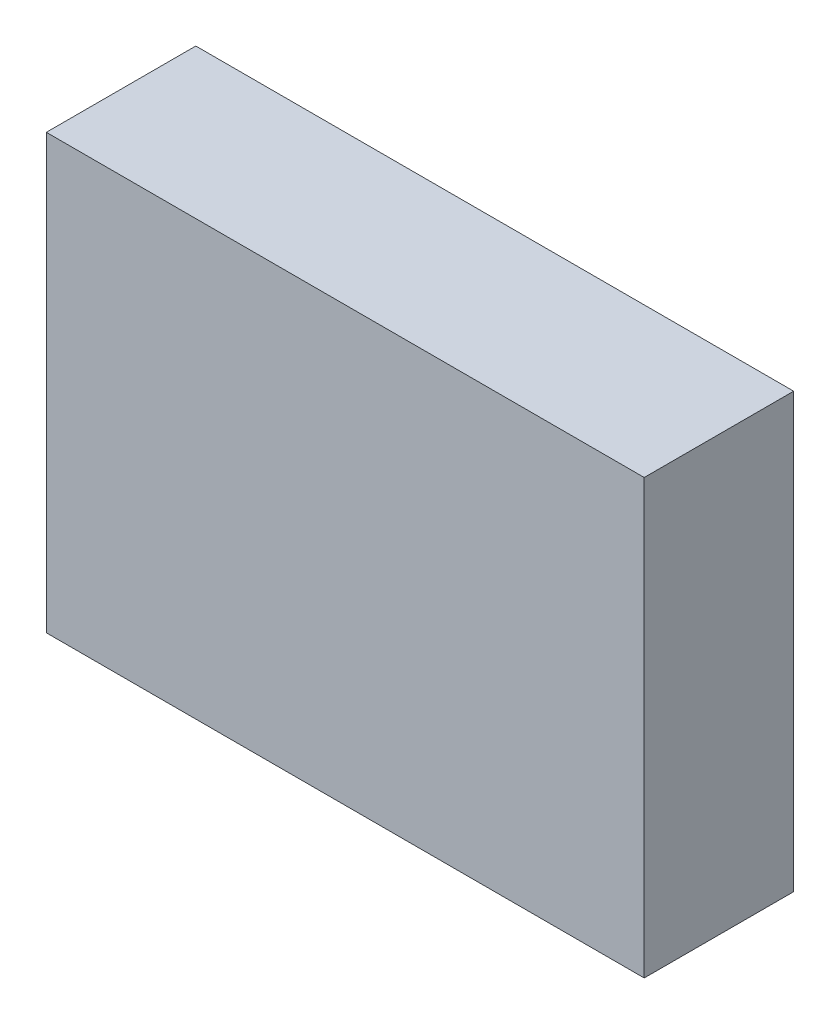
ISO-10303-21;
HEADER;
FILE_DESCRIPTION(('STEP AP214'),'2;1');
FILE_NAME('part.step','',(''),(''),'','','');
FILE_SCHEMA(('AUTOMOTIVE_DESIGN { 1 0 10303 214 1 1 1 1 }'));
ENDSEC;
DATA;
#1=APPLICATION_CONTEXT('core data for automotive mechanical design processes');
#2=APPLICATION_PROTOCOL_DEFINITION('international standard','automotive_design',2000,#1);
#3=PRODUCT_CONTEXT('',#1,'mechanical');
#4=PRODUCT('Part','Part','',(#3));
#5=PRODUCT_RELATED_PRODUCT_CATEGORY('part','',(#4));
#6=PRODUCT_DEFINITION_FORMATION('','',#4);
#7=PRODUCT_DEFINITION_CONTEXT('part definition',#1,'design');
#8=PRODUCT_DEFINITION('design','',#6,#7);
#9=PRODUCT_DEFINITION_SHAPE('','',#8);
#10=(LENGTH_UNIT() NAMED_UNIT(*) SI_UNIT(.MILLI.,.METRE.));
#11=(NAMED_UNIT(*) PLANE_ANGLE_UNIT() SI_UNIT($,.RADIAN.));
#12=(NAMED_UNIT(*) SI_UNIT($,.STERADIAN.) SOLID_ANGLE_UNIT());
#13=UNCERTAINTY_MEASURE_WITH_UNIT(LENGTH_MEASURE(1.E-05),#10,'distance_accuracy_value','');
#14=(GEOMETRIC_REPRESENTATION_CONTEXT(3) GLOBAL_UNCERTAINTY_ASSIGNED_CONTEXT((#13)) GLOBAL_UNIT_ASSIGNED_CONTEXT((#10,
#11,#12)) REPRESENTATION_CONTEXT('',''));
#15=CARTESIAN_POINT('',(0.,0.,0.));
#16=DIRECTION('',(0.,0.,1.));
#17=DIRECTION('',(1.,0.,0.));
#18=AXIS2_PLACEMENT_3D('',#15,#16,#17);
#19=CARTESIAN_POINT('',(0.,0.,-10.));
#20=DIRECTION('',(-1.,0.,0.));
#21=DIRECTION('',(0.,0.,1.));
#22=AXIS2_PLACEMENT_3D('',#19,#20,#21);
#23=PLANE('',#22);
#24=DIRECTION('',(0.,-1.,0.));
#25=VECTOR('',#24,1.);
#26=CARTESIAN_POINT('',(0.,0.,0.));
#27=LINE('',#26,#25);
#28=CARTESIAN_POINT('',(0.,29.,0.));
#29=VERTEX_POINT('',#28);
#30=CARTESIAN_POINT('',(0.,0.,0.));
#31=VERTEX_POINT('',#30);
#32=EDGE_CURVE('E107',#29,#31,#27,.T.);
#33=ORIENTED_EDGE('',*,*,#32,.F.);
#34=DIRECTION('',(0.,0.,1.));
#35=VECTOR('',#34,1.);
#36=CARTESIAN_POINT('',(0.,29.,-10.));
#37=LINE('',#36,#35);
#38=CARTESIAN_POINT('',(0.,29.,-10.));
#39=VERTEX_POINT('',#38);
#40=EDGE_CURVE('E11',#39,#29,#37,.T.);
#41=ORIENTED_EDGE('',*,*,#40,.F.);
#42=DIRECTION('',(0.,-1.,0.));
#43=VECTOR('',#42,1.);
#44=CARTESIAN_POINT('',(0.,0.,-10.));
#45=LINE('',#44,#43);
#46=CARTESIAN_POINT('',(0.,0.,-10.));
#47=VERTEX_POINT('',#46);
#48=EDGE_CURVE('E102',#39,#47,#45,.T.);
#49=ORIENTED_EDGE('',*,*,#48,.T.);
#50=DIRECTION('',(0.,0.,1.));
#51=VECTOR('',#50,1.);
#52=CARTESIAN_POINT('',(0.,0.,-10.));
#53=LINE('',#52,#51);
#54=EDGE_CURVE('E46',#47,#31,#53,.T.);
#55=ORIENTED_EDGE('',*,*,#54,.T.);
#56=EDGE_LOOP('',(#33,#41,#49,#55));
#57=FACE_BOUND('',#56,.T.);
#58=ADVANCED_FACE('F43',(#57),#23,.T.);
#59=CARTESIAN_POINT('',(0.,29.,-10.));
#60=DIRECTION('',(0.,1.,0.));
#61=DIRECTION('',(0.,0.,1.));
#62=AXIS2_PLACEMENT_3D('',#59,#60,#61);
#63=PLANE('',#62);
#64=DIRECTION('',(-1.,0.,0.));
#65=VECTOR('',#64,1.);
#66=CARTESIAN_POINT('',(0.,29.,0.));
#67=LINE('',#66,#65);
#68=CARTESIAN_POINT('',(40.,29.,0.));
#69=VERTEX_POINT('',#68);
#70=EDGE_CURVE('E104',#69,#29,#67,.T.);
#71=ORIENTED_EDGE('',*,*,#70,.F.);
#72=DIRECTION('',(0.,0.,1.));
#73=VECTOR('',#72,1.);
#74=CARTESIAN_POINT('',(40.,29.,-10.));
#75=LINE('',#74,#73);
#76=CARTESIAN_POINT('',(40.,29.,-10.));
#77=VERTEX_POINT('',#76);
#78=EDGE_CURVE('E55',#77,#69,#75,.T.);
#79=ORIENTED_EDGE('',*,*,#78,.F.);
#80=DIRECTION('',(-1.,0.,0.));
#81=VECTOR('',#80,1.);
#82=CARTESIAN_POINT('',(0.,29.,-10.));
#83=LINE('',#82,#81);
#84=EDGE_CURVE('E97',#77,#39,#83,.T.);
#85=ORIENTED_EDGE('',*,*,#84,.T.);
#86=ORIENTED_EDGE('',*,*,#40,.T.);
#87=EDGE_LOOP('',(#71,#79,#85,#86));
#88=FACE_BOUND('',#87,.T.);
#89=ADVANCED_FACE('F117',(#88),#63,.T.);
#90=CARTESIAN_POINT('',(40.,0.,-10.));
#91=DIRECTION('',(1.,0.,0.));
#92=DIRECTION('',(0.,0.,-1.));
#93=AXIS2_PLACEMENT_3D('',#90,#91,#92);
#94=PLANE('',#93);
#95=DIRECTION('',(0.,1.,0.));
#96=VECTOR('',#95,1.);
#97=CARTESIAN_POINT('',(40.,0.,0.));
#98=LINE('',#97,#96);
#99=CARTESIAN_POINT('',(40.,0.,0.));
#100=VERTEX_POINT('',#99);
#101=EDGE_CURVE('E93',#100,#69,#98,.T.);
#102=ORIENTED_EDGE('',*,*,#101,.F.);
#103=DIRECTION('',(0.,0.,1.));
#104=VECTOR('',#103,1.);
#105=CARTESIAN_POINT('',(40.,0.,-10.));
#106=LINE('',#105,#104);
#107=CARTESIAN_POINT('',(40.,0.,-10.));
#108=VERTEX_POINT('',#107);
#109=EDGE_CURVE('E88',#108,#100,#106,.T.);
#110=ORIENTED_EDGE('',*,*,#109,.F.);
#111=DIRECTION('',(0.,1.,0.));
#112=VECTOR('',#111,1.);
#113=CARTESIAN_POINT('',(40.,0.,-10.));
#114=LINE('',#113,#112);
#115=EDGE_CURVE('E91',#108,#77,#114,.T.);
#116=ORIENTED_EDGE('',*,*,#115,.T.);
#117=ORIENTED_EDGE('',*,*,#78,.T.);
#118=EDGE_LOOP('',(#102,#110,#116,#117));
#119=FACE_BOUND('',#118,.T.);
#120=ADVANCED_FACE('F89',(#119),#94,.T.);
#121=CARTESIAN_POINT('',(0.,0.,-10.));
#122=DIRECTION('',(0.,-1.,0.));
#123=DIRECTION('',(0.,0.,-1.));
#124=AXIS2_PLACEMENT_3D('',#121,#122,#123);
#125=PLANE('',#124);
#126=DIRECTION('',(1.,0.,0.));
#127=VECTOR('',#126,1.);
#128=CARTESIAN_POINT('',(0.,0.,0.));
#129=LINE('',#128,#127);
#130=EDGE_CURVE('E110',#31,#100,#129,.T.);
#131=ORIENTED_EDGE('',*,*,#130,.F.);
#132=ORIENTED_EDGE('',*,*,#54,.F.);
#133=DIRECTION('',(1.,0.,0.));
#134=VECTOR('',#133,1.);
#135=CARTESIAN_POINT('',(0.,0.,-10.));
#136=LINE('',#135,#134);
#137=EDGE_CURVE('E100',#47,#108,#136,.T.);
#138=ORIENTED_EDGE('',*,*,#137,.T.);
#139=ORIENTED_EDGE('',*,*,#109,.T.);
#140=EDGE_LOOP('',(#131,#132,#138,#139));
#141=FACE_BOUND('',#140,.T.);
#142=ADVANCED_FACE('F99',(#141),#125,.T.);
#143=CARTESIAN_POINT('',(0.,0.,-10.));
#144=DIRECTION('',(0.,0.,-1.));
#145=DIRECTION('',(-1.,0.,0.));
#146=AXIS2_PLACEMENT_3D('',#143,#144,#145);
#147=PLANE('',#146);
#148=ORIENTED_EDGE('',*,*,#48,.F.);
#149=ORIENTED_EDGE('',*,*,#84,.F.);
#150=ORIENTED_EDGE('',*,*,#115,.F.);
#151=ORIENTED_EDGE('',*,*,#137,.F.);
#152=EDGE_LOOP('',(#148,#149,#150,#151));
#153=FACE_BOUND('',#152,.T.);
#154=ADVANCED_FACE('F96',(#153),#147,.T.);
#155=CARTESIAN_POINT('',(0.,0.,0.));
#156=DIRECTION('',(0.,0.,-1.));
#157=DIRECTION('',(-1.,0.,0.));
#158=AXIS2_PLACEMENT_3D('',#155,#156,#157);
#159=PLANE('',#158);
#160=ORIENTED_EDGE('',*,*,#32,.T.);
#161=ORIENTED_EDGE('',*,*,#130,.T.);
#162=ORIENTED_EDGE('',*,*,#101,.T.);
#163=ORIENTED_EDGE('',*,*,#70,.T.);
#164=EDGE_LOOP('',(#160,#161,#162,#163));
#165=FACE_BOUND('',#164,.T.);
#166=ADVANCED_FACE('F116',(#165),#159,.F.);
#167=CLOSED_SHELL('',(#58,#89,#120,#142,#154,#166));
#168=MANIFOLD_SOLID_BREP('B2',#167);
#169=ADVANCED_BREP_SHAPE_REPRESENTATION('',(#18,#168),#14);
#170=SHAPE_DEFINITION_REPRESENTATION(#9,#169);
ENDSEC;
END-ISO-10303-21;
